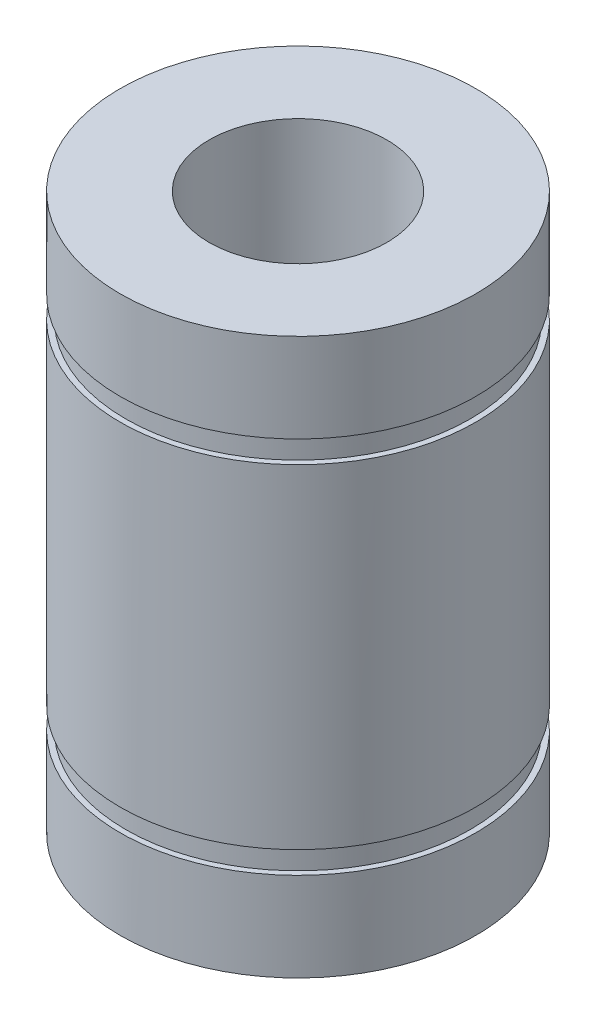
ISO-10303-21;
HEADER;
FILE_DESCRIPTION(('STEP AP214'),'2;1');
FILE_NAME('part.step','',(''),(''),'','','');
FILE_SCHEMA(('AUTOMOTIVE_DESIGN { 1 0 10303 214 1 1 1 1 }'));
ENDSEC;
DATA;
#1=APPLICATION_CONTEXT('core data for automotive mechanical design processes');
#2=APPLICATION_PROTOCOL_DEFINITION('international standard','automotive_design',2000,#1);
#3=PRODUCT_CONTEXT('',#1,'mechanical');
#4=PRODUCT('Part','Part','',(#3));
#5=PRODUCT_RELATED_PRODUCT_CATEGORY('part','',(#4));
#6=PRODUCT_DEFINITION_FORMATION('','',#4);
#7=PRODUCT_DEFINITION_CONTEXT('part definition',#1,'design');
#8=PRODUCT_DEFINITION('design','',#6,#7);
#9=PRODUCT_DEFINITION_SHAPE('','',#8);
#10=(LENGTH_UNIT() NAMED_UNIT(*) SI_UNIT(.MILLI.,.METRE.));
#11=(NAMED_UNIT(*) PLANE_ANGLE_UNIT() SI_UNIT($,.RADIAN.));
#12=(NAMED_UNIT(*) SI_UNIT($,.STERADIAN.) SOLID_ANGLE_UNIT());
#13=UNCERTAINTY_MEASURE_WITH_UNIT(LENGTH_MEASURE(1.E-05),#10,'distance_accuracy_value','');
#14=(GEOMETRIC_REPRESENTATION_CONTEXT(3) GLOBAL_UNCERTAINTY_ASSIGNED_CONTEXT((#13)) GLOBAL_UNIT_ASSIGNED_CONTEXT((#10,
#11,#12)) REPRESENTATION_CONTEXT('',''));
#15=CARTESIAN_POINT('',(0.,0.,0.));
#16=DIRECTION('',(0.,0.,1.));
#17=DIRECTION('',(1.,0.,0.));
#18=AXIS2_PLACEMENT_3D('',#15,#16,#17);
#19=CARTESIAN_POINT('',(0.,25.,0.));
#20=DIRECTION('',(0.,-1.,0.));
#21=DIRECTION('',(0.,0.,-1.));
#22=AXIS2_PLACEMENT_3D('',#19,#20,#21);
#23=CYLINDRICAL_SURFACE('',#22,8.);
#24=CARTESIAN_POINT('',(0.,4.,0.));
#25=DIRECTION('',(0.,-1.,0.));
#26=DIRECTION('',(0.,0.,-1.));
#27=AXIS2_PLACEMENT_3D('',#24,#25,#26);
#28=CIRCLE('',#27,8.);
#29=CARTESIAN_POINT('',(0.,4.,-8.));
#30=VERTEX_POINT('',#29);
#31=EDGE_CURVE('E64',#30,#30,#28,.T.);
#32=ORIENTED_EDGE('',*,*,#31,.T.);
#33=EDGE_LOOP('',(#32));
#34=FACE_BOUND('',#33,.T.);
#35=CARTESIAN_POINT('',(0.,0.,0.));
#36=DIRECTION('',(0.,1.,0.));
#37=DIRECTION('',(0.,0.,1.));
#38=AXIS2_PLACEMENT_3D('',#35,#36,#37);
#39=CIRCLE('',#38,8.);
#40=CARTESIAN_POINT('',(0.,0.,8.));
#41=VERTEX_POINT('',#40);
#42=EDGE_CURVE('E48',#41,#41,#39,.T.);
#43=ORIENTED_EDGE('',*,*,#42,.T.);
#44=EDGE_LOOP('',(#43));
#45=FACE_BOUND('',#44,.T.);
#46=ADVANCED_FACE('F39',(#34,#45),#23,.T.);
#47=CARTESIAN_POINT('',(0.,25.,0.));
#48=DIRECTION('',(0.,1.,0.));
#49=DIRECTION('',(0.,0.,1.));
#50=AXIS2_PLACEMENT_3D('',#47,#48,#49);
#51=PLANE('',#50);
#52=CARTESIAN_POINT('',(0.,25.,0.));
#53=DIRECTION('',(0.,1.,0.));
#54=DIRECTION('',(0.,0.,1.));
#55=AXIS2_PLACEMENT_3D('',#52,#53,#54);
#56=CIRCLE('',#55,8.);
#57=CARTESIAN_POINT('',(0.,25.,8.));
#58=VERTEX_POINT('',#57);
#59=EDGE_CURVE('E10',#58,#58,#56,.T.);
#60=ORIENTED_EDGE('',*,*,#59,.T.);
#61=EDGE_LOOP('',(#60));
#62=FACE_BOUND('',#61,.T.);
#63=CARTESIAN_POINT('',(0.,25.,0.));
#64=DIRECTION('',(0.,1.,0.));
#65=DIRECTION('',(0.,0.,1.));
#66=AXIS2_PLACEMENT_3D('',#63,#64,#65);
#67=CIRCLE('',#66,4.);
#68=CARTESIAN_POINT('',(0.,25.,4.));
#69=VERTEX_POINT('',#68);
#70=EDGE_CURVE('E54',#69,#69,#67,.T.);
#71=ORIENTED_EDGE('',*,*,#70,.F.);
#72=EDGE_LOOP('',(#71));
#73=FACE_BOUND('',#72,.T.);
#74=ADVANCED_FACE('F127',(#62,#73),#51,.T.);
#75=CARTESIAN_POINT('',(0.,0.,0.));
#76=DIRECTION('',(0.,1.,0.));
#77=DIRECTION('',(0.,0.,1.));
#78=AXIS2_PLACEMENT_3D('',#75,#76,#77);
#79=PLANE('',#78);
#80=ORIENTED_EDGE('',*,*,#42,.F.);
#81=EDGE_LOOP('',(#80));
#82=FACE_BOUND('',#81,.T.);
#83=CARTESIAN_POINT('',(0.,0.,0.));
#84=DIRECTION('',(0.,1.,0.));
#85=DIRECTION('',(0.,0.,1.));
#86=AXIS2_PLACEMENT_3D('',#83,#84,#85);
#87=CIRCLE('',#86,4.);
#88=CARTESIAN_POINT('',(0.,0.,4.));
#89=VERTEX_POINT('',#88);
#90=EDGE_CURVE('E57',#89,#89,#87,.T.);
#91=ORIENTED_EDGE('',*,*,#90,.T.);
#92=EDGE_LOOP('',(#91));
#93=FACE_BOUND('',#92,.T.);
#94=ADVANCED_FACE('F132',(#82,#93),#79,.F.);
#95=CARTESIAN_POINT('',(0.,21.,0.));
#96=DIRECTION('',(0.,1.,0.));
#97=DIRECTION('',(0.,0.,1.));
#98=AXIS2_PLACEMENT_3D('',#95,#96,#97);
#99=CIRCLE('',#98,8.);
#100=CARTESIAN_POINT('',(0.,21.,8.));
#101=VERTEX_POINT('',#100);
#102=EDGE_CURVE('E68',#101,#101,#99,.T.);
#103=ORIENTED_EDGE('',*,*,#102,.T.);
#104=EDGE_LOOP('',(#103));
#105=FACE_BOUND('',#104,.T.);
#106=ORIENTED_EDGE('',*,*,#59,.F.);
#107=EDGE_LOOP('',(#106));
#108=FACE_BOUND('',#107,.T.);
#109=ADVANCED_FACE('F41',(#105,#108),#23,.T.);
#110=CARTESIAN_POINT('',(0.,25.,0.));
#111=DIRECTION('',(0.,-1.,0.));
#112=DIRECTION('',(0.,0.,-1.));
#113=AXIS2_PLACEMENT_3D('',#110,#111,#112);
#114=CYLINDRICAL_SURFACE('',#113,4.);
#115=ORIENTED_EDGE('',*,*,#70,.T.);
#116=EDGE_LOOP('',(#115));
#117=FACE_BOUND('',#116,.T.);
#118=ORIENTED_EDGE('',*,*,#90,.F.);
#119=EDGE_LOOP('',(#118));
#120=FACE_BOUND('',#119,.T.);
#121=ADVANCED_FACE('F136',(#117,#120),#114,.F.);
#122=CARTESIAN_POINT('',(-9.,4.,0.));
#123=DIRECTION('',(0.,-1.,0.));
#124=DIRECTION('',(0.,0.,-1.));
#125=AXIS2_PLACEMENT_3D('',#122,#123,#124);
#126=PLANE('',#125);
#127=CARTESIAN_POINT('',(0.,4.,0.));
#128=DIRECTION('',(0.,1.,0.));
#129=DIRECTION('',(0.,0.,1.));
#130=AXIS2_PLACEMENT_3D('',#127,#128,#129);
#131=CIRCLE('',#130,7.75);
#132=CARTESIAN_POINT('',(0.,4.,7.75));
#133=VERTEX_POINT('',#132);
#134=EDGE_CURVE('E86',#133,#133,#131,.T.);
#135=ORIENTED_EDGE('',*,*,#134,.F.);
#136=EDGE_LOOP('',(#135));
#137=FACE_BOUND('',#136,.T.);
#138=ORIENTED_EDGE('',*,*,#31,.F.);
#139=EDGE_LOOP('',(#138));
#140=FACE_BOUND('',#139,.T.);
#141=ADVANCED_FACE('F144',(#137,#140),#126,.F.);
#142=CARTESIAN_POINT('',(-9.,5.,0.));
#143=DIRECTION('',(0.,1.,0.));
#144=DIRECTION('',(0.,0.,1.));
#145=AXIS2_PLACEMENT_3D('',#142,#143,#144);
#146=PLANE('',#145);
#147=CARTESIAN_POINT('',(0.,5.,0.));
#148=DIRECTION('',(0.,1.,0.));
#149=DIRECTION('',(0.,0.,1.));
#150=AXIS2_PLACEMENT_3D('',#147,#148,#149);
#151=CIRCLE('',#150,7.75);
#152=CARTESIAN_POINT('',(0.,5.,7.75));
#153=VERTEX_POINT('',#152);
#154=EDGE_CURVE('E91',#153,#153,#151,.T.);
#155=ORIENTED_EDGE('',*,*,#154,.T.);
#156=EDGE_LOOP('',(#155));
#157=FACE_BOUND('',#156,.T.);
#158=CARTESIAN_POINT('',(0.,5.,0.));
#159=DIRECTION('',(0.,1.,0.));
#160=DIRECTION('',(0.,0.,1.));
#161=AXIS2_PLACEMENT_3D('',#158,#159,#160);
#162=CIRCLE('',#161,8.);
#163=CARTESIAN_POINT('',(0.,5.,8.));
#164=VERTEX_POINT('',#163);
#165=EDGE_CURVE('E60',#164,#164,#162,.T.);
#166=ORIENTED_EDGE('',*,*,#165,.F.);
#167=EDGE_LOOP('',(#166));
#168=FACE_BOUND('',#167,.T.);
#169=ADVANCED_FACE('F122',(#157,#168),#146,.F.);
#170=CARTESIAN_POINT('',(0.,25.,0.));
#171=DIRECTION('',(0.,1.,0.));
#172=DIRECTION('',(0.,0.,1.));
#173=AXIS2_PLACEMENT_3D('',#170,#171,#172);
#174=CYLINDRICAL_SURFACE('',#173,7.75);
#175=ORIENTED_EDGE('',*,*,#154,.F.);
#176=EDGE_LOOP('',(#175));
#177=FACE_BOUND('',#176,.T.);
#178=ORIENTED_EDGE('',*,*,#134,.T.);
#179=EDGE_LOOP('',(#178));
#180=FACE_BOUND('',#179,.T.);
#181=ADVANCED_FACE('F115',(#177,#180),#174,.T.);
#182=CARTESIAN_POINT('',(-9.,20.,0.));
#183=DIRECTION('',(0.,-1.,0.));
#184=DIRECTION('',(0.,0.,-1.));
#185=AXIS2_PLACEMENT_3D('',#182,#183,#184);
#186=PLANE('',#185);
#187=CARTESIAN_POINT('',(0.,20.,0.));
#188=DIRECTION('',(0.,1.,0.));
#189=DIRECTION('',(0.,0.,1.));
#190=AXIS2_PLACEMENT_3D('',#187,#188,#189);
#191=CIRCLE('',#190,7.75);
#192=CARTESIAN_POINT('',(0.,20.,7.75));
#193=VERTEX_POINT('',#192);
#194=EDGE_CURVE('E65',#193,#193,#191,.T.);
#195=ORIENTED_EDGE('',*,*,#194,.F.);
#196=EDGE_LOOP('',(#195));
#197=FACE_BOUND('',#196,.T.);
#198=CARTESIAN_POINT('',(0.,20.,0.));
#199=DIRECTION('',(0.,-1.,0.));
#200=DIRECTION('',(0.,0.,-1.));
#201=AXIS2_PLACEMENT_3D('',#198,#199,#200);
#202=CIRCLE('',#201,8.);
#203=CARTESIAN_POINT('',(0.,20.,-8.));
#204=VERTEX_POINT('',#203);
#205=EDGE_CURVE('E43',#204,#204,#202,.T.);
#206=ORIENTED_EDGE('',*,*,#205,.F.);
#207=EDGE_LOOP('',(#206));
#208=FACE_BOUND('',#207,.T.);
#209=ADVANCED_FACE('F112',(#197,#208),#186,.F.);
#210=CARTESIAN_POINT('',(-9.,21.,0.));
#211=DIRECTION('',(0.,1.,0.));
#212=DIRECTION('',(0.,0.,1.));
#213=AXIS2_PLACEMENT_3D('',#210,#211,#212);
#214=PLANE('',#213);
#215=CARTESIAN_POINT('',(0.,21.,0.));
#216=DIRECTION('',(0.,1.,0.));
#217=DIRECTION('',(0.,0.,1.));
#218=AXIS2_PLACEMENT_3D('',#215,#216,#217);
#219=CIRCLE('',#218,7.75);
#220=CARTESIAN_POINT('',(0.,21.,7.75));
#221=VERTEX_POINT('',#220);
#222=EDGE_CURVE('E90',#221,#221,#219,.T.);
#223=ORIENTED_EDGE('',*,*,#222,.T.);
#224=EDGE_LOOP('',(#223));
#225=FACE_BOUND('',#224,.T.);
#226=ORIENTED_EDGE('',*,*,#102,.F.);
#227=EDGE_LOOP('',(#226));
#228=FACE_BOUND('',#227,.T.);
#229=ADVANCED_FACE('F102',(#225,#228),#214,.F.);
#230=CARTESIAN_POINT('',(0.,25.,0.));
#231=DIRECTION('',(0.,1.,0.));
#232=DIRECTION('',(0.,0.,1.));
#233=AXIS2_PLACEMENT_3D('',#230,#231,#232);
#234=CYLINDRICAL_SURFACE('',#233,7.75);
#235=ORIENTED_EDGE('',*,*,#222,.F.);
#236=EDGE_LOOP('',(#235));
#237=FACE_BOUND('',#236,.T.);
#238=ORIENTED_EDGE('',*,*,#194,.T.);
#239=EDGE_LOOP('',(#238));
#240=FACE_BOUND('',#239,.T.);
#241=ADVANCED_FACE('F105',(#237,#240),#234,.T.);
#242=ORIENTED_EDGE('',*,*,#205,.T.);
#243=EDGE_LOOP('',(#242));
#244=FACE_BOUND('',#243,.T.);
#245=ORIENTED_EDGE('',*,*,#165,.T.);
#246=EDGE_LOOP('',(#245));
#247=FACE_BOUND('',#246,.T.);
#248=ADVANCED_FACE('F108',(#244,#247),#23,.T.);
#249=CLOSED_SHELL('',(#46,#74,#94,#109,#121,#141,#169,#181,#209,#229,#241,#248));
#250=MANIFOLD_SOLID_BREP('B2',#249);
#251=ADVANCED_BREP_SHAPE_REPRESENTATION('',(#18,#250),#14);
#252=SHAPE_DEFINITION_REPRESENTATION(#9,#251);
ENDSEC;
END-ISO-10303-21;
